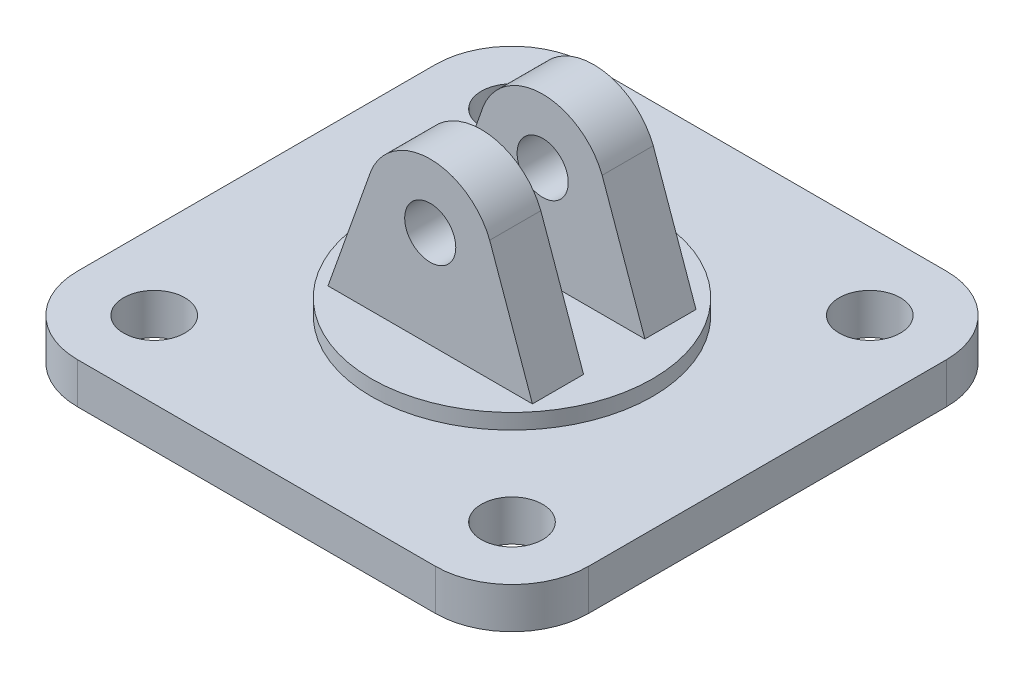
ISO-10303-21;
HEADER;
FILE_DESCRIPTION(('STEP AP214'),'2;1');
FILE_NAME('part.step','',(''),(''),'','','');
FILE_SCHEMA(('AUTOMOTIVE_DESIGN { 1 0 10303 214 1 1 1 1 }'));
ENDSEC;
DATA;
#1=APPLICATION_CONTEXT('core data for automotive mechanical design processes');
#2=APPLICATION_PROTOCOL_DEFINITION('international standard','automotive_design',2000,#1);
#3=PRODUCT_CONTEXT('',#1,'mechanical');
#4=PRODUCT('Part','Part','',(#3));
#5=PRODUCT_RELATED_PRODUCT_CATEGORY('part','',(#4));
#6=PRODUCT_DEFINITION_FORMATION('','',#4);
#7=PRODUCT_DEFINITION_CONTEXT('part definition',#1,'design');
#8=PRODUCT_DEFINITION('design','',#6,#7);
#9=PRODUCT_DEFINITION_SHAPE('','',#8);
#10=(LENGTH_UNIT() NAMED_UNIT(*) SI_UNIT(.MILLI.,.METRE.));
#11=(NAMED_UNIT(*) PLANE_ANGLE_UNIT() SI_UNIT($,.RADIAN.));
#12=(NAMED_UNIT(*) SI_UNIT($,.STERADIAN.) SOLID_ANGLE_UNIT());
#13=UNCERTAINTY_MEASURE_WITH_UNIT(LENGTH_MEASURE(1.E-05),#10,'distance_accuracy_value','');
#14=(GEOMETRIC_REPRESENTATION_CONTEXT(3) GLOBAL_UNCERTAINTY_ASSIGNED_CONTEXT((#13)) GLOBAL_UNIT_ASSIGNED_CONTEXT((#10,
#11,#12)) REPRESENTATION_CONTEXT('',''));
#15=CARTESIAN_POINT('',(0.,0.,0.));
#16=DIRECTION('',(0.,0.,1.));
#17=DIRECTION('',(1.,0.,0.));
#18=AXIS2_PLACEMENT_3D('',#15,#16,#17);
#19=CARTESIAN_POINT('',(21.2299093237961,7.53448680981674,16.));
#20=DIRECTION('',(0.942409652489535,0.334460830134942,0.));
#21=DIRECTION('',(-0.334460830134942,0.942409652489535,0.));
#22=AXIS2_PLACEMENT_3D('',#19,#20,#21);
#23=PLANE('',#22);
#24=DIRECTION('',(0.,0.,-1.));
#25=VECTOR('',#24,1.);
#26=CARTESIAN_POINT('',(20.,11.,16.));
#27=LINE('',#26,#25);
#28=CARTESIAN_POINT('',(20.,11.,16.));
#29=VERTEX_POINT('',#28);
#30=CARTESIAN_POINT('',(20.,11.,6.));
#31=VERTEX_POINT('',#30);
#32=EDGE_CURVE('E219',#29,#31,#27,.T.);
#33=ORIENTED_EDGE('',*,*,#32,.T.);
#34=DIRECTION('',(-0.334460830134942,0.942409652489535,0.));
#35=VECTOR('',#34,1.);
#36=CARTESIAN_POINT('',(21.2299093237961,7.53448680981674,6.));
#37=LINE('',#36,#35);
#38=CARTESIAN_POINT('',(11.6384792466265,34.5602413122384,6.));
#39=VERTEX_POINT('',#38);
#40=EDGE_CURVE('E388',#31,#39,#37,.T.);
#41=ORIENTED_EDGE('',*,*,#40,.T.);
#42=DIRECTION('',(0.,0.,-1.));
#43=VECTOR('',#42,1.);
#44=CARTESIAN_POINT('',(11.6384792466264,34.5602413122384,16.));
#45=LINE('',#44,#43);
#46=CARTESIAN_POINT('',(11.6384792466264,34.5602413122384,16.));
#47=VERTEX_POINT('',#46);
#48=EDGE_CURVE('E231',#47,#39,#45,.T.);
#49=ORIENTED_EDGE('',*,*,#48,.F.);
#50=DIRECTION('',(0.334460830134942,-0.942409652489535,0.));
#51=VECTOR('',#50,1.);
#52=CARTESIAN_POINT('',(21.2299093237961,7.53448680981674,16.));
#53=LINE('',#52,#51);
#54=EDGE_CURVE('E401',#47,#29,#53,.T.);
#55=ORIENTED_EDGE('',*,*,#54,.T.);
#56=EDGE_LOOP('',(#33,#41,#49,#55));
#57=FACE_BOUND('',#56,.T.);
#58=ADVANCED_FACE('F35',(#57),#23,.T.);
#59=CARTESIAN_POINT('',(0.,30.,16.));
#60=DIRECTION('',(0.,0.,-1.));
#61=DIRECTION('',(-1.,0.,0.));
#62=AXIS2_PLACEMENT_3D('',#59,#60,#61);
#63=CYLINDRICAL_SURFACE('',#62,12.5);
#64=CARTESIAN_POINT('',(0.,30.,6.));
#65=DIRECTION('',(0.,0.,-1.));
#66=DIRECTION('',(-1.,0.,0.));
#67=AXIS2_PLACEMENT_3D('',#64,#65,#66);
#68=CIRCLE('',#67,12.5);
#69=CARTESIAN_POINT('',(-11.6384792466266,34.5602413122381,6.));
#70=VERTEX_POINT('',#69);
#71=EDGE_CURVE('E385',#70,#39,#68,.T.);
#72=ORIENTED_EDGE('',*,*,#71,.F.);
#73=DIRECTION('',(0.,0.,-1.));
#74=VECTOR('',#73,1.);
#75=CARTESIAN_POINT('',(-11.6384792466266,34.5602413122381,16.));
#76=LINE('',#75,#74);
#77=CARTESIAN_POINT('',(-11.6384792466266,34.5602413122381,16.));
#78=VERTEX_POINT('',#77);
#79=EDGE_CURVE('E227',#78,#70,#76,.T.);
#80=ORIENTED_EDGE('',*,*,#79,.F.);
#81=CARTESIAN_POINT('',(0.,30.,16.));
#82=DIRECTION('',(0.,0.,1.));
#83=DIRECTION('',(1.,0.,0.));
#84=AXIS2_PLACEMENT_3D('',#81,#82,#83);
#85=CIRCLE('',#84,12.5);
#86=EDGE_CURVE('E405',#47,#78,#85,.T.);
#87=ORIENTED_EDGE('',*,*,#86,.F.);
#88=ORIENTED_EDGE('',*,*,#48,.T.);
#89=EDGE_LOOP('',(#72,#80,#87,#88));
#90=FACE_BOUND('',#89,.T.);
#91=ADVANCED_FACE('F431',(#90),#63,.T.);
#92=CARTESIAN_POINT('',(-21.2299093237961,7.53448680981671,16.));
#93=DIRECTION('',(-0.942409652489535,0.334460830134941,0.));
#94=DIRECTION('',(-0.334460830134941,-0.942409652489535,0.));
#95=AXIS2_PLACEMENT_3D('',#92,#93,#94);
#96=PLANE('',#95);
#97=ORIENTED_EDGE('',*,*,#79,.T.);
#98=DIRECTION('',(-0.334460830134941,-0.942409652489535,0.));
#99=VECTOR('',#98,1.);
#100=CARTESIAN_POINT('',(-21.2299093237961,7.53448680981671,6.));
#101=LINE('',#100,#99);
#102=CARTESIAN_POINT('',(-20.,11.,6.));
#103=VERTEX_POINT('',#102);
#104=EDGE_CURVE('E382',#70,#103,#101,.T.);
#105=ORIENTED_EDGE('',*,*,#104,.T.);
#106=DIRECTION('',(0.,0.,-1.));
#107=VECTOR('',#106,1.);
#108=CARTESIAN_POINT('',(-20.,11.,16.));
#109=LINE('',#108,#107);
#110=CARTESIAN_POINT('',(-20.,11.,16.));
#111=VERTEX_POINT('',#110);
#112=EDGE_CURVE('E218',#111,#103,#109,.T.);
#113=ORIENTED_EDGE('',*,*,#112,.F.);
#114=DIRECTION('',(0.334460830134941,0.942409652489535,0.));
#115=VECTOR('',#114,1.);
#116=CARTESIAN_POINT('',(-21.2299093237961,7.53448680981671,16.));
#117=LINE('',#116,#115);
#118=EDGE_CURVE('E407',#111,#78,#117,.T.);
#119=ORIENTED_EDGE('',*,*,#118,.T.);
#120=EDGE_LOOP('',(#97,#105,#113,#119));
#121=FACE_BOUND('',#120,.T.);
#122=ADVANCED_FACE('F438',(#121),#96,.T.);
#123=CARTESIAN_POINT('',(0.,30.,16.));
#124=DIRECTION('',(0.,0.,-1.));
#125=DIRECTION('',(-1.,0.,0.));
#126=AXIS2_PLACEMENT_3D('',#123,#124,#125);
#127=CYLINDRICAL_SURFACE('',#126,5.);
#128=CARTESIAN_POINT('',(0.,30.,16.));
#129=DIRECTION('',(0.,0.,1.));
#130=DIRECTION('',(1.,0.,0.));
#131=AXIS2_PLACEMENT_3D('',#128,#129,#130);
#132=CIRCLE('',#131,5.);
#133=CARTESIAN_POINT('',(5.,30.,16.));
#134=VERTEX_POINT('',#133);
#135=EDGE_CURVE('E398',#134,#134,#132,.T.);
#136=ORIENTED_EDGE('',*,*,#135,.T.);
#137=EDGE_LOOP('',(#136));
#138=FACE_BOUND('',#137,.T.);
#139=CARTESIAN_POINT('',(0.,30.,6.));
#140=DIRECTION('',(0.,0.,-1.));
#141=DIRECTION('',(-1.,0.,0.));
#142=AXIS2_PLACEMENT_3D('',#139,#140,#141);
#143=CIRCLE('',#142,5.);
#144=CARTESIAN_POINT('',(-5.,30.,6.));
#145=VERTEX_POINT('',#144);
#146=EDGE_CURVE('E212',#145,#145,#143,.T.);
#147=ORIENTED_EDGE('',*,*,#146,.T.);
#148=EDGE_LOOP('',(#147));
#149=FACE_BOUND('',#148,.T.);
#150=ADVANCED_FACE('F452',(#138,#149),#127,.F.);
#151=CARTESIAN_POINT('',(0.,11.,0.));
#152=DIRECTION('',(0.,1.,0.));
#153=DIRECTION('',(0.,0.,1.));
#154=AXIS2_PLACEMENT_3D('',#151,#152,#153);
#155=PLANE('',#154);
#156=DIRECTION('',(1.,0.,0.));
#157=VECTOR('',#156,1.);
#158=CARTESIAN_POINT('',(-20.,11.,6.));
#159=LINE('',#158,#157);
#160=EDGE_CURVE('E52',#103,#31,#159,.T.);
#161=ORIENTED_EDGE('',*,*,#160,.T.);
#162=ORIENTED_EDGE('',*,*,#32,.F.);
#163=DIRECTION('',(1.,0.,0.));
#164=VECTOR('',#163,1.);
#165=CARTESIAN_POINT('',(0.,11.,16.));
#166=LINE('',#165,#164);
#167=EDGE_CURVE('E410',#111,#29,#166,.T.);
#168=ORIENTED_EDGE('',*,*,#167,.F.);
#169=ORIENTED_EDGE('',*,*,#112,.T.);
#170=EDGE_LOOP('',(#161,#162,#168,#169));
#171=FACE_BOUND('',#170,.T.);
#172=CARTESIAN_POINT('',(0.,11.,0.));
#173=DIRECTION('',(0.,1.,0.));
#174=DIRECTION('',(0.,0.,1.));
#175=AXIS2_PLACEMENT_3D('',#172,#173,#174);
#176=CIRCLE('',#175,27.5);
#177=CARTESIAN_POINT('',(0.,11.,27.5));
#178=VERTEX_POINT('',#177);
#179=EDGE_CURVE('E320',#178,#178,#176,.T.);
#180=ORIENTED_EDGE('',*,*,#179,.T.);
#181=EDGE_LOOP('',(#180));
#182=FACE_BOUND('',#181,.T.);
#183=CARTESIAN_POINT('',(20.,11.,-6.));
#184=VERTEX_POINT('',#183);
#185=CARTESIAN_POINT('',(20.,11.,-16.));
#186=VERTEX_POINT('',#185);
#187=EDGE_CURVE('E211',#184,#186,#27,.T.);
#188=ORIENTED_EDGE('',*,*,#187,.F.);
#189=DIRECTION('',(1.,0.,0.));
#190=VECTOR('',#189,1.);
#191=CARTESIAN_POINT('',(-20.,11.,-6.));
#192=LINE('',#191,#190);
#193=CARTESIAN_POINT('',(-20.,11.,-6.));
#194=VERTEX_POINT('',#193);
#195=EDGE_CURVE('E202',#194,#184,#192,.T.);
#196=ORIENTED_EDGE('',*,*,#195,.F.);
#197=CARTESIAN_POINT('',(-20.,11.,-16.));
#198=VERTEX_POINT('',#197);
#199=EDGE_CURVE('E60',#194,#198,#109,.T.);
#200=ORIENTED_EDGE('',*,*,#199,.T.);
#201=DIRECTION('',(1.,0.,0.));
#202=VECTOR('',#201,1.);
#203=CARTESIAN_POINT('',(0.,11.,-16.));
#204=LINE('',#203,#202);
#205=EDGE_CURVE('E402',#198,#186,#204,.T.);
#206=ORIENTED_EDGE('',*,*,#205,.T.);
#207=EDGE_LOOP('',(#188,#196,#200,#206));
#208=FACE_BOUND('',#207,.T.);
#209=ADVANCED_FACE('F210',(#171,#182,#208),#155,.T.);
#210=CARTESIAN_POINT('',(35.,8.,35.));
#211=DIRECTION('',(0.,-1.,0.));
#212=DIRECTION('',(0.,0.,-1.));
#213=AXIS2_PLACEMENT_3D('',#210,#211,#212);
#214=CYLINDRICAL_SURFACE('',#213,15.);
#215=CARTESIAN_POINT('',(35.,0.,35.));
#216=DIRECTION('',(0.,1.,0.));
#217=DIRECTION('',(0.,0.,-1.));
#218=AXIS2_PLACEMENT_3D('',#215,#216,#217);
#219=CIRCLE('',#218,15.);
#220=CARTESIAN_POINT('',(34.9999999999999,0.,50.));
#221=VERTEX_POINT('',#220);
#222=CARTESIAN_POINT('',(50.,0.,34.9999999999999));
#223=VERTEX_POINT('',#222);
#224=EDGE_CURVE('E324',#221,#223,#219,.T.);
#225=ORIENTED_EDGE('',*,*,#224,.T.);
#226=DIRECTION('',(0.,-1.,0.));
#227=VECTOR('',#226,1.);
#228=CARTESIAN_POINT('',(50.,8.,34.9999999999999));
#229=LINE('',#228,#227);
#230=CARTESIAN_POINT('',(50.,8.,34.9999999999999));
#231=VERTEX_POINT('',#230);
#232=EDGE_CURVE('E44',#231,#223,#229,.T.);
#233=ORIENTED_EDGE('',*,*,#232,.F.);
#234=CARTESIAN_POINT('',(35.,8.,35.));
#235=DIRECTION('',(0.,1.,0.));
#236=DIRECTION('',(0.,0.,-1.));
#237=AXIS2_PLACEMENT_3D('',#234,#235,#236);
#238=CIRCLE('',#237,15.);
#239=CARTESIAN_POINT('',(34.9999999999999,8.,50.));
#240=VERTEX_POINT('',#239);
#241=EDGE_CURVE('E326',#240,#231,#238,.T.);
#242=ORIENTED_EDGE('',*,*,#241,.F.);
#243=DIRECTION('',(0.,-1.,0.));
#244=VECTOR('',#243,1.);
#245=CARTESIAN_POINT('',(34.9999999999999,8.,50.));
#246=LINE('',#245,#244);
#247=EDGE_CURVE('E344',#240,#221,#246,.T.);
#248=ORIENTED_EDGE('',*,*,#247,.T.);
#249=EDGE_LOOP('',(#225,#233,#242,#248));
#250=FACE_BOUND('',#249,.T.);
#251=ADVANCED_FACE('F37',(#250),#214,.T.);
#252=CARTESIAN_POINT('',(50.,8.,-34.9999999999999));
#253=DIRECTION('',(-1.,0.,0.));
#254=DIRECTION('',(0.,0.,1.));
#255=AXIS2_PLACEMENT_3D('',#252,#253,#254);
#256=PLANE('',#255);
#257=DIRECTION('',(0.,0.,-1.));
#258=VECTOR('',#257,1.);
#259=CARTESIAN_POINT('',(50.,0.,-34.9999999999999));
#260=LINE('',#259,#258);
#261=CARTESIAN_POINT('',(50.,0.,-34.9999999999999));
#262=VERTEX_POINT('',#261);
#263=EDGE_CURVE('E347',#223,#262,#260,.T.);
#264=ORIENTED_EDGE('',*,*,#263,.T.);
#265=DIRECTION('',(0.,-1.,0.));
#266=VECTOR('',#265,1.);
#267=CARTESIAN_POINT('',(50.,8.,-34.9999999999999));
#268=LINE('',#267,#266);
#269=CARTESIAN_POINT('',(50.,8.,-34.9999999999999));
#270=VERTEX_POINT('',#269);
#271=EDGE_CURVE('E377',#270,#262,#268,.T.);
#272=ORIENTED_EDGE('',*,*,#271,.F.);
#273=DIRECTION('',(0.,0.,-1.));
#274=VECTOR('',#273,1.);
#275=CARTESIAN_POINT('',(50.,8.,-34.9999999999999));
#276=LINE('',#275,#274);
#277=EDGE_CURVE('E329',#231,#270,#276,.T.);
#278=ORIENTED_EDGE('',*,*,#277,.F.);
#279=ORIENTED_EDGE('',*,*,#232,.T.);
#280=EDGE_LOOP('',(#264,#272,#278,#279));
#281=FACE_BOUND('',#280,.T.);
#282=ADVANCED_FACE('F541',(#281),#256,.F.);
#283=CARTESIAN_POINT('',(35.,8.,-35.));
#284=DIRECTION('',(0.,-1.,0.));
#285=DIRECTION('',(0.,0.,-1.));
#286=AXIS2_PLACEMENT_3D('',#283,#284,#285);
#287=CYLINDRICAL_SURFACE('',#286,15.);
#288=CARTESIAN_POINT('',(35.,0.,-35.));
#289=DIRECTION('',(0.,1.,0.));
#290=DIRECTION('',(0.,0.,-1.));
#291=AXIS2_PLACEMENT_3D('',#288,#289,#290);
#292=CIRCLE('',#291,15.);
#293=CARTESIAN_POINT('',(34.9999999999999,0.,-50.));
#294=VERTEX_POINT('',#293);
#295=EDGE_CURVE('E349',#262,#294,#292,.T.);
#296=ORIENTED_EDGE('',*,*,#295,.T.);
#297=DIRECTION('',(0.,-1.,0.));
#298=VECTOR('',#297,1.);
#299=CARTESIAN_POINT('',(34.9999999999999,8.,-50.));
#300=LINE('',#299,#298);
#301=CARTESIAN_POINT('',(34.9999999999999,8.,-50.));
#302=VERTEX_POINT('',#301);
#303=EDGE_CURVE('E374',#302,#294,#300,.T.);
#304=ORIENTED_EDGE('',*,*,#303,.F.);
#305=CARTESIAN_POINT('',(35.,8.,-35.));
#306=DIRECTION('',(0.,1.,0.));
#307=DIRECTION('',(0.,0.,-1.));
#308=AXIS2_PLACEMENT_3D('',#305,#306,#307);
#309=CIRCLE('',#308,15.);
#310=EDGE_CURVE('E332',#270,#302,#309,.T.);
#311=ORIENTED_EDGE('',*,*,#310,.F.);
#312=ORIENTED_EDGE('',*,*,#271,.T.);
#313=EDGE_LOOP('',(#296,#304,#311,#312));
#314=FACE_BOUND('',#313,.T.);
#315=ADVANCED_FACE('F538',(#314),#287,.T.);
#316=CARTESIAN_POINT('',(34.9999999999999,8.,-50.));
#317=DIRECTION('',(0.,0.,1.));
#318=DIRECTION('',(1.,0.,0.));
#319=AXIS2_PLACEMENT_3D('',#316,#317,#318);
#320=PLANE('',#319);
#321=DIRECTION('',(-1.,0.,0.));
#322=VECTOR('',#321,1.);
#323=CARTESIAN_POINT('',(34.9999999999999,0.,-50.));
#324=LINE('',#323,#322);
#325=CARTESIAN_POINT('',(-34.9999999999999,0.,-50.));
#326=VERTEX_POINT('',#325);
#327=EDGE_CURVE('E351',#294,#326,#324,.T.);
#328=ORIENTED_EDGE('',*,*,#327,.T.);
#329=DIRECTION('',(0.,-1.,0.));
#330=VECTOR('',#329,1.);
#331=CARTESIAN_POINT('',(-34.9999999999999,8.,-50.));
#332=LINE('',#331,#330);
#333=CARTESIAN_POINT('',(-34.9999999999999,8.,-50.));
#334=VERTEX_POINT('',#333);
#335=EDGE_CURVE('E371',#334,#326,#332,.T.);
#336=ORIENTED_EDGE('',*,*,#335,.F.);
#337=DIRECTION('',(-1.,0.,0.));
#338=VECTOR('',#337,1.);
#339=CARTESIAN_POINT('',(34.9999999999999,8.,-50.));
#340=LINE('',#339,#338);
#341=EDGE_CURVE('E334',#302,#334,#340,.T.);
#342=ORIENTED_EDGE('',*,*,#341,.F.);
#343=ORIENTED_EDGE('',*,*,#303,.T.);
#344=EDGE_LOOP('',(#328,#336,#342,#343));
#345=FACE_BOUND('',#344,.T.);
#346=ADVANCED_FACE('F534',(#345),#320,.F.);
#347=CARTESIAN_POINT('',(-35.,8.,-35.));
#348=DIRECTION('',(0.,-1.,0.));
#349=DIRECTION('',(0.,0.,-1.));
#350=AXIS2_PLACEMENT_3D('',#347,#348,#349);
#351=CYLINDRICAL_SURFACE('',#350,15.);
#352=CARTESIAN_POINT('',(-35.,0.,-35.));
#353=DIRECTION('',(0.,1.,0.));
#354=DIRECTION('',(0.,0.,1.));
#355=AXIS2_PLACEMENT_3D('',#352,#353,#354);
#356=CIRCLE('',#355,15.);
#357=CARTESIAN_POINT('',(-50.,0.,-34.9999999999999));
#358=VERTEX_POINT('',#357);
#359=EDGE_CURVE('E353',#326,#358,#356,.T.);
#360=ORIENTED_EDGE('',*,*,#359,.T.);
#361=DIRECTION('',(0.,-1.,0.));
#362=VECTOR('',#361,1.);
#363=CARTESIAN_POINT('',(-50.,8.,-34.9999999999999));
#364=LINE('',#363,#362);
#365=CARTESIAN_POINT('',(-50.,8.,-34.9999999999999));
#366=VERTEX_POINT('',#365);
#367=EDGE_CURVE('E368',#366,#358,#364,.T.);
#368=ORIENTED_EDGE('',*,*,#367,.F.);
#369=CARTESIAN_POINT('',(-35.,8.,-35.));
#370=DIRECTION('',(0.,1.,0.));
#371=DIRECTION('',(0.,0.,1.));
#372=AXIS2_PLACEMENT_3D('',#369,#370,#371);
#373=CIRCLE('',#372,15.);
#374=EDGE_CURVE('E336',#334,#366,#373,.T.);
#375=ORIENTED_EDGE('',*,*,#374,.F.);
#376=ORIENTED_EDGE('',*,*,#335,.T.);
#377=EDGE_LOOP('',(#360,#368,#375,#376));
#378=FACE_BOUND('',#377,.T.);
#379=ADVANCED_FACE('F530',(#378),#351,.T.);
#380=CARTESIAN_POINT('',(-50.,8.,-34.9999999999999));
#381=DIRECTION('',(1.,0.,0.));
#382=DIRECTION('',(0.,0.,-1.));
#383=AXIS2_PLACEMENT_3D('',#380,#381,#382);
#384=PLANE('',#383);
#385=DIRECTION('',(0.,0.,1.));
#386=VECTOR('',#385,1.);
#387=CARTESIAN_POINT('',(-50.,0.,-34.9999999999999));
#388=LINE('',#387,#386);
#389=CARTESIAN_POINT('',(-50.,0.,34.9999999999999));
#390=VERTEX_POINT('',#389);
#391=EDGE_CURVE('E355',#358,#390,#388,.T.);
#392=ORIENTED_EDGE('',*,*,#391,.T.);
#393=DIRECTION('',(0.,-1.,0.));
#394=VECTOR('',#393,1.);
#395=CARTESIAN_POINT('',(-50.,8.,34.9999999999999));
#396=LINE('',#395,#394);
#397=CARTESIAN_POINT('',(-50.,8.,34.9999999999999));
#398=VERTEX_POINT('',#397);
#399=EDGE_CURVE('E365',#398,#390,#396,.T.);
#400=ORIENTED_EDGE('',*,*,#399,.F.);
#401=DIRECTION('',(0.,0.,1.));
#402=VECTOR('',#401,1.);
#403=CARTESIAN_POINT('',(-50.,8.,-34.9999999999999));
#404=LINE('',#403,#402);
#405=EDGE_CURVE('E338',#366,#398,#404,.T.);
#406=ORIENTED_EDGE('',*,*,#405,.F.);
#407=ORIENTED_EDGE('',*,*,#367,.T.);
#408=EDGE_LOOP('',(#392,#400,#406,#407));
#409=FACE_BOUND('',#408,.T.);
#410=ADVANCED_FACE('F526',(#409),#384,.F.);
#411=CARTESIAN_POINT('',(-35.,8.,35.));
#412=DIRECTION('',(0.,-1.,0.));
#413=DIRECTION('',(0.,0.,-1.));
#414=AXIS2_PLACEMENT_3D('',#411,#412,#413);
#415=CYLINDRICAL_SURFACE('',#414,15.);
#416=CARTESIAN_POINT('',(-35.,0.,35.));
#417=DIRECTION('',(0.,1.,0.));
#418=DIRECTION('',(0.,0.,-1.));
#419=AXIS2_PLACEMENT_3D('',#416,#417,#418);
#420=CIRCLE('',#419,15.);
#421=CARTESIAN_POINT('',(-34.9999999999999,0.,50.));
#422=VERTEX_POINT('',#421);
#423=EDGE_CURVE('E357',#390,#422,#420,.T.);
#424=ORIENTED_EDGE('',*,*,#423,.T.);
#425=DIRECTION('',(0.,-1.,0.));
#426=VECTOR('',#425,1.);
#427=CARTESIAN_POINT('',(-34.9999999999999,8.,50.));
#428=LINE('',#427,#426);
#429=CARTESIAN_POINT('',(-34.9999999999999,8.,50.));
#430=VERTEX_POINT('',#429);
#431=EDGE_CURVE('E362',#430,#422,#428,.T.);
#432=ORIENTED_EDGE('',*,*,#431,.F.);
#433=CARTESIAN_POINT('',(-35.,8.,35.));
#434=DIRECTION('',(0.,1.,0.));
#435=DIRECTION('',(0.,0.,-1.));
#436=AXIS2_PLACEMENT_3D('',#433,#434,#435);
#437=CIRCLE('',#436,15.);
#438=EDGE_CURVE('E340',#398,#430,#437,.T.);
#439=ORIENTED_EDGE('',*,*,#438,.F.);
#440=ORIENTED_EDGE('',*,*,#399,.T.);
#441=EDGE_LOOP('',(#424,#432,#439,#440));
#442=FACE_BOUND('',#441,.T.);
#443=ADVANCED_FACE('F522',(#442),#415,.T.);
#444=CARTESIAN_POINT('',(34.9999999999999,8.,50.));
#445=DIRECTION('',(0.,0.,-1.));
#446=DIRECTION('',(-1.,0.,0.));
#447=AXIS2_PLACEMENT_3D('',#444,#445,#446);
#448=PLANE('',#447);
#449=DIRECTION('',(1.,0.,0.));
#450=VECTOR('',#449,1.);
#451=CARTESIAN_POINT('',(34.9999999999999,0.,50.));
#452=LINE('',#451,#450);
#453=EDGE_CURVE('E330',#422,#221,#452,.T.);
#454=ORIENTED_EDGE('',*,*,#453,.T.);
#455=ORIENTED_EDGE('',*,*,#247,.F.);
#456=DIRECTION('',(1.,0.,0.));
#457=VECTOR('',#456,1.);
#458=CARTESIAN_POINT('',(34.9999999999999,8.,50.));
#459=LINE('',#458,#457);
#460=EDGE_CURVE('E342',#430,#240,#459,.T.);
#461=ORIENTED_EDGE('',*,*,#460,.F.);
#462=ORIENTED_EDGE('',*,*,#431,.T.);
#463=EDGE_LOOP('',(#454,#455,#461,#462));
#464=FACE_BOUND('',#463,.T.);
#465=ADVANCED_FACE('F515',(#464),#448,.F.);
#466=CARTESIAN_POINT('',(35.,8.,35.));
#467=DIRECTION('',(0.,-1.,0.));
#468=DIRECTION('',(0.,0.,-1.));
#469=AXIS2_PLACEMENT_3D('',#466,#467,#468);
#470=PLANE('',#469);
#471=CARTESIAN_POINT('',(-35.,8.,35.));
#472=DIRECTION('',(0.,1.,0.));
#473=DIRECTION('',(0.,0.,1.));
#474=AXIS2_PLACEMENT_3D('',#471,#472,#473);
#475=CIRCLE('',#474,6.);
#476=CARTESIAN_POINT('',(-35.,8.,41.));
#477=VERTEX_POINT('',#476);
#478=EDGE_CURVE('E303',#477,#477,#475,.T.);
#479=ORIENTED_EDGE('',*,*,#478,.F.);
#480=EDGE_LOOP('',(#479));
#481=FACE_BOUND('',#480,.T.);
#482=CARTESIAN_POINT('',(35.,8.,-35.));
#483=DIRECTION('',(0.,1.,0.));
#484=DIRECTION('',(0.,0.,1.));
#485=AXIS2_PLACEMENT_3D('',#482,#483,#484);
#486=CIRCLE('',#485,6.);
#487=CARTESIAN_POINT('',(35.,8.,-29.));
#488=VERTEX_POINT('',#487);
#489=EDGE_CURVE('E309',#488,#488,#486,.T.);
#490=ORIENTED_EDGE('',*,*,#489,.F.);
#491=EDGE_LOOP('',(#490));
#492=FACE_BOUND('',#491,.T.);
#493=CARTESIAN_POINT('',(35.,8.,35.));
#494=DIRECTION('',(0.,1.,0.));
#495=DIRECTION('',(0.,0.,1.));
#496=AXIS2_PLACEMENT_3D('',#493,#494,#495);
#497=CIRCLE('',#496,6.);
#498=CARTESIAN_POINT('',(35.,8.,41.));
#499=VERTEX_POINT('',#498);
#500=EDGE_CURVE('E284',#499,#499,#497,.T.);
#501=ORIENTED_EDGE('',*,*,#500,.F.);
#502=EDGE_LOOP('',(#501));
#503=FACE_BOUND('',#502,.T.);
#504=CARTESIAN_POINT('',(-35.,8.,-35.));
#505=DIRECTION('',(0.,1.,0.));
#506=DIRECTION('',(0.,0.,1.));
#507=AXIS2_PLACEMENT_3D('',#504,#505,#506);
#508=CIRCLE('',#507,6.);
#509=CARTESIAN_POINT('',(-35.,8.,-29.));
#510=VERTEX_POINT('',#509);
#511=EDGE_CURVE('E302',#510,#510,#508,.T.);
#512=ORIENTED_EDGE('',*,*,#511,.F.);
#513=EDGE_LOOP('',(#512));
#514=FACE_BOUND('',#513,.T.);
#515=CARTESIAN_POINT('',(0.,8.,0.));
#516=DIRECTION('',(0.,1.,0.));
#517=DIRECTION('',(0.,0.,1.));
#518=AXIS2_PLACEMENT_3D('',#515,#516,#517);
#519=CIRCLE('',#518,27.5);
#520=CARTESIAN_POINT('',(0.,8.,27.5));
#521=VERTEX_POINT('',#520);
#522=EDGE_CURVE('E11',#521,#521,#519,.T.);
#523=ORIENTED_EDGE('',*,*,#522,.F.);
#524=EDGE_LOOP('',(#523));
#525=FACE_BOUND('',#524,.T.);
#526=ORIENTED_EDGE('',*,*,#241,.T.);
#527=ORIENTED_EDGE('',*,*,#277,.T.);
#528=ORIENTED_EDGE('',*,*,#310,.T.);
#529=ORIENTED_EDGE('',*,*,#341,.T.);
#530=ORIENTED_EDGE('',*,*,#374,.T.);
#531=ORIENTED_EDGE('',*,*,#405,.T.);
#532=ORIENTED_EDGE('',*,*,#438,.T.);
#533=ORIENTED_EDGE('',*,*,#460,.T.);
#534=EDGE_LOOP('',(#526,#527,#528,#529,#530,#531,#532,#533));
#535=FACE_BOUND('',#534,.T.);
#536=ADVANCED_FACE('F512',(#481,#492,#503,#514,#525,#535),#470,.F.);
#537=CARTESIAN_POINT('',(35.,0.,35.));
#538=DIRECTION('',(0.,-1.,0.));
#539=DIRECTION('',(0.,0.,-1.));
#540=AXIS2_PLACEMENT_3D('',#537,#538,#539);
#541=PLANE('',#540);
#542=CARTESIAN_POINT('',(-20.,0.,20.));
#543=DIRECTION('',(0.,-1.,0.));
#544=DIRECTION('',(0.,0.,1.));
#545=AXIS2_PLACEMENT_3D('',#542,#543,#544);
#546=CIRCLE('',#545,5.);
#547=CARTESIAN_POINT('',(-20.,0.,25.));
#548=VERTEX_POINT('',#547);
#549=CARTESIAN_POINT('',(-25.,0.,20.));
#550=VERTEX_POINT('',#549);
#551=EDGE_CURVE('E234',#548,#550,#546,.T.);
#552=ORIENTED_EDGE('',*,*,#551,.F.);
#553=DIRECTION('',(-1.,0.,0.));
#554=VECTOR('',#553,1.);
#555=CARTESIAN_POINT('',(-20.,0.,25.));
#556=LINE('',#555,#554);
#557=CARTESIAN_POINT('',(20.,0.,25.));
#558=VERTEX_POINT('',#557);
#559=EDGE_CURVE('E239',#558,#548,#556,.T.);
#560=ORIENTED_EDGE('',*,*,#559,.F.);
#561=CARTESIAN_POINT('',(20.,0.,20.));
#562=DIRECTION('',(0.,-1.,0.));
#563=DIRECTION('',(0.,0.,1.));
#564=AXIS2_PLACEMENT_3D('',#561,#562,#563);
#565=CIRCLE('',#564,5.);
#566=CARTESIAN_POINT('',(25.,0.,20.));
#567=VERTEX_POINT('',#566);
#568=EDGE_CURVE('E277',#567,#558,#565,.T.);
#569=ORIENTED_EDGE('',*,*,#568,.F.);
#570=DIRECTION('',(0.,0.,1.));
#571=VECTOR('',#570,1.);
#572=CARTESIAN_POINT('',(25.,0.,-20.));
#573=LINE('',#572,#571);
#574=CARTESIAN_POINT('',(25.,0.,-20.));
#575=VERTEX_POINT('',#574);
#576=EDGE_CURVE('E274',#575,#567,#573,.T.);
#577=ORIENTED_EDGE('',*,*,#576,.F.);
#578=CARTESIAN_POINT('',(20.,0.,-20.));
#579=DIRECTION('',(0.,-1.,0.));
#580=DIRECTION('',(0.,0.,-1.));
#581=AXIS2_PLACEMENT_3D('',#578,#579,#580);
#582=CIRCLE('',#581,5.);
#583=CARTESIAN_POINT('',(20.,0.,-25.));
#584=VERTEX_POINT('',#583);
#585=EDGE_CURVE('E271',#584,#575,#582,.T.);
#586=ORIENTED_EDGE('',*,*,#585,.F.);
#587=DIRECTION('',(1.,0.,0.));
#588=VECTOR('',#587,1.);
#589=CARTESIAN_POINT('',(-20.,0.,-25.));
#590=LINE('',#589,#588);
#591=CARTESIAN_POINT('',(-20.,0.,-25.));
#592=VERTEX_POINT('',#591);
#593=EDGE_CURVE('E268',#592,#584,#590,.T.);
#594=ORIENTED_EDGE('',*,*,#593,.F.);
#595=CARTESIAN_POINT('',(-20.,0.,-20.));
#596=DIRECTION('',(0.,-1.,0.));
#597=DIRECTION('',(0.,0.,1.));
#598=AXIS2_PLACEMENT_3D('',#595,#596,#597);
#599=CIRCLE('',#598,5.);
#600=CARTESIAN_POINT('',(-25.,0.,-20.));
#601=VERTEX_POINT('',#600);
#602=EDGE_CURVE('E265',#601,#592,#599,.T.);
#603=ORIENTED_EDGE('',*,*,#602,.F.);
#604=DIRECTION('',(0.,0.,-1.));
#605=VECTOR('',#604,1.);
#606=CARTESIAN_POINT('',(-25.,0.,-20.));
#607=LINE('',#606,#605);
#608=EDGE_CURVE('E262',#550,#601,#607,.T.);
#609=ORIENTED_EDGE('',*,*,#608,.F.);
#610=EDGE_LOOP('',(#552,#560,#569,#577,#586,#594,#603,#609));
#611=FACE_BOUND('',#610,.T.);
#612=CARTESIAN_POINT('',(-35.,0.,35.));
#613=DIRECTION('',(0.,1.,0.));
#614=DIRECTION('',(0.,0.,1.));
#615=AXIS2_PLACEMENT_3D('',#612,#613,#614);
#616=CIRCLE('',#615,6.);
#617=CARTESIAN_POINT('',(-35.,0.,41.));
#618=VERTEX_POINT('',#617);
#619=EDGE_CURVE('E299',#618,#618,#616,.T.);
#620=ORIENTED_EDGE('',*,*,#619,.T.);
#621=EDGE_LOOP('',(#620));
#622=FACE_BOUND('',#621,.T.);
#623=CARTESIAN_POINT('',(35.,0.,-35.));
#624=DIRECTION('',(0.,1.,0.));
#625=DIRECTION('',(0.,0.,1.));
#626=AXIS2_PLACEMENT_3D('',#623,#624,#625);
#627=CIRCLE('',#626,6.);
#628=CARTESIAN_POINT('',(35.,0.,-29.));
#629=VERTEX_POINT('',#628);
#630=EDGE_CURVE('E306',#629,#629,#627,.T.);
#631=ORIENTED_EDGE('',*,*,#630,.T.);
#632=EDGE_LOOP('',(#631));
#633=FACE_BOUND('',#632,.T.);
#634=CARTESIAN_POINT('',(35.,0.,35.));
#635=DIRECTION('',(0.,1.,0.));
#636=DIRECTION('',(0.,0.,1.));
#637=AXIS2_PLACEMENT_3D('',#634,#635,#636);
#638=CIRCLE('',#637,6.);
#639=CARTESIAN_POINT('',(35.,0.,41.));
#640=VERTEX_POINT('',#639);
#641=EDGE_CURVE('E312',#640,#640,#638,.T.);
#642=ORIENTED_EDGE('',*,*,#641,.T.);
#643=EDGE_LOOP('',(#642));
#644=FACE_BOUND('',#643,.T.);
#645=CARTESIAN_POINT('',(-35.,0.,-35.));
#646=DIRECTION('',(0.,1.,0.));
#647=DIRECTION('',(0.,0.,1.));
#648=AXIS2_PLACEMENT_3D('',#645,#646,#647);
#649=CIRCLE('',#648,6.);
#650=CARTESIAN_POINT('',(-35.,0.,-29.));
#651=VERTEX_POINT('',#650);
#652=EDGE_CURVE('E317',#651,#651,#649,.T.);
#653=ORIENTED_EDGE('',*,*,#652,.T.);
#654=EDGE_LOOP('',(#653));
#655=FACE_BOUND('',#654,.T.);
#656=ORIENTED_EDGE('',*,*,#224,.F.);
#657=ORIENTED_EDGE('',*,*,#453,.F.);
#658=ORIENTED_EDGE('',*,*,#423,.F.);
#659=ORIENTED_EDGE('',*,*,#391,.F.);
#660=ORIENTED_EDGE('',*,*,#359,.F.);
#661=ORIENTED_EDGE('',*,*,#327,.F.);
#662=ORIENTED_EDGE('',*,*,#295,.F.);
#663=ORIENTED_EDGE('',*,*,#263,.F.);
#664=EDGE_LOOP('',(#656,#657,#658,#659,#660,#661,#662,#663));
#665=FACE_BOUND('',#664,.T.);
#666=ADVANCED_FACE('F510',(#611,#622,#633,#644,#655,#665),#541,.T.);
#667=CARTESIAN_POINT('',(0.,11.,0.));
#668=DIRECTION('',(0.,-1.,0.));
#669=DIRECTION('',(0.,0.,-1.));
#670=AXIS2_PLACEMENT_3D('',#667,#668,#669);
#671=CYLINDRICAL_SURFACE('',#670,27.5);
#672=ORIENTED_EDGE('',*,*,#179,.F.);
#673=EDGE_LOOP('',(#672));
#674=FACE_BOUND('',#673,.T.);
#675=ORIENTED_EDGE('',*,*,#522,.T.);
#676=EDGE_LOOP('',(#675));
#677=FACE_BOUND('',#676,.T.);
#678=ADVANCED_FACE('F503',(#674,#677),#671,.T.);
#679=CARTESIAN_POINT('',(-35.,0.,-35.));
#680=DIRECTION('',(0.,1.,0.));
#681=DIRECTION('',(0.,0.,1.));
#682=AXIS2_PLACEMENT_3D('',#679,#680,#681);
#683=CYLINDRICAL_SURFACE('',#682,6.);
#684=ORIENTED_EDGE('',*,*,#652,.F.);
#685=EDGE_LOOP('',(#684));
#686=FACE_BOUND('',#685,.T.);
#687=ORIENTED_EDGE('',*,*,#511,.T.);
#688=EDGE_LOOP('',(#687));
#689=FACE_BOUND('',#688,.T.);
#690=ADVANCED_FACE('F499',(#686,#689),#683,.F.);
#691=CARTESIAN_POINT('',(35.,0.,35.));
#692=DIRECTION('',(0.,1.,0.));
#693=DIRECTION('',(0.,0.,1.));
#694=AXIS2_PLACEMENT_3D('',#691,#692,#693);
#695=CYLINDRICAL_SURFACE('',#694,6.);
#696=ORIENTED_EDGE('',*,*,#641,.F.);
#697=EDGE_LOOP('',(#696));
#698=FACE_BOUND('',#697,.T.);
#699=ORIENTED_EDGE('',*,*,#500,.T.);
#700=EDGE_LOOP('',(#699));
#701=FACE_BOUND('',#700,.T.);
#702=ADVANCED_FACE('F495',(#698,#701),#695,.F.);
#703=CARTESIAN_POINT('',(35.,0.,-35.));
#704=DIRECTION('',(0.,1.,0.));
#705=DIRECTION('',(0.,0.,1.));
#706=AXIS2_PLACEMENT_3D('',#703,#704,#705);
#707=CYLINDRICAL_SURFACE('',#706,6.);
#708=ORIENTED_EDGE('',*,*,#630,.F.);
#709=EDGE_LOOP('',(#708));
#710=FACE_BOUND('',#709,.T.);
#711=ORIENTED_EDGE('',*,*,#489,.T.);
#712=EDGE_LOOP('',(#711));
#713=FACE_BOUND('',#712,.T.);
#714=ADVANCED_FACE('F491',(#710,#713),#707,.F.);
#715=CARTESIAN_POINT('',(-35.,0.,35.));
#716=DIRECTION('',(0.,1.,0.));
#717=DIRECTION('',(0.,0.,1.));
#718=AXIS2_PLACEMENT_3D('',#715,#716,#717);
#719=CYLINDRICAL_SURFACE('',#718,6.);
#720=ORIENTED_EDGE('',*,*,#619,.F.);
#721=EDGE_LOOP('',(#720));
#722=FACE_BOUND('',#721,.T.);
#723=ORIENTED_EDGE('',*,*,#478,.T.);
#724=EDGE_LOOP('',(#723));
#725=FACE_BOUND('',#724,.T.);
#726=ADVANCED_FACE('F487',(#722,#725),#719,.F.);
#727=CARTESIAN_POINT('',(-20.,2.,20.));
#728=DIRECTION('',(0.,-1.,0.));
#729=DIRECTION('',(0.,0.,-1.));
#730=AXIS2_PLACEMENT_3D('',#727,#728,#729);
#731=CYLINDRICAL_SURFACE('',#730,5.);
#732=ORIENTED_EDGE('',*,*,#551,.T.);
#733=DIRECTION('',(0.,-1.,0.));
#734=VECTOR('',#733,1.);
#735=CARTESIAN_POINT('',(-25.,2.,20.));
#736=LINE('',#735,#734);
#737=CARTESIAN_POINT('',(-25.,2.,20.));
#738=VERTEX_POINT('',#737);
#739=EDGE_CURVE('E260',#738,#550,#736,.T.);
#740=ORIENTED_EDGE('',*,*,#739,.F.);
#741=CARTESIAN_POINT('',(-20.,2.,20.));
#742=DIRECTION('',(0.,-1.,0.));
#743=DIRECTION('',(0.,0.,1.));
#744=AXIS2_PLACEMENT_3D('',#741,#742,#743);
#745=CIRCLE('',#744,5.);
#746=CARTESIAN_POINT('',(-20.,2.,25.));
#747=VERTEX_POINT('',#746);
#748=EDGE_CURVE('E235',#747,#738,#745,.T.);
#749=ORIENTED_EDGE('',*,*,#748,.F.);
#750=DIRECTION('',(0.,-1.,0.));
#751=VECTOR('',#750,1.);
#752=CARTESIAN_POINT('',(-20.,2.,25.));
#753=LINE('',#752,#751);
#754=EDGE_CURVE('E282',#747,#548,#753,.T.);
#755=ORIENTED_EDGE('',*,*,#754,.T.);
#756=EDGE_LOOP('',(#732,#740,#749,#755));
#757=FACE_BOUND('',#756,.T.);
#758=ADVANCED_FACE('F461',(#757),#731,.F.);
#759=CARTESIAN_POINT('',(-20.,2.,25.));
#760=DIRECTION('',(0.,0.,1.));
#761=DIRECTION('',(1.,0.,0.));
#762=AXIS2_PLACEMENT_3D('',#759,#760,#761);
#763=PLANE('',#762);
#764=ORIENTED_EDGE('',*,*,#559,.T.);
#765=ORIENTED_EDGE('',*,*,#754,.F.);
#766=DIRECTION('',(-1.,0.,0.));
#767=VECTOR('',#766,1.);
#768=CARTESIAN_POINT('',(-20.,2.,25.));
#769=LINE('',#768,#767);
#770=CARTESIAN_POINT('',(20.,2.,25.));
#771=VERTEX_POINT('',#770);
#772=EDGE_CURVE('E257',#771,#747,#769,.T.);
#773=ORIENTED_EDGE('',*,*,#772,.F.);
#774=DIRECTION('',(0.,-1.,0.));
#775=VECTOR('',#774,1.);
#776=CARTESIAN_POINT('',(20.,2.,25.));
#777=LINE('',#776,#775);
#778=EDGE_CURVE('E285',#771,#558,#777,.T.);
#779=ORIENTED_EDGE('',*,*,#778,.T.);
#780=EDGE_LOOP('',(#764,#765,#773,#779));
#781=FACE_BOUND('',#780,.T.);
#782=ADVANCED_FACE('F457',(#781),#763,.F.);
#783=CARTESIAN_POINT('',(20.,2.,20.));
#784=DIRECTION('',(0.,-1.,0.));
#785=DIRECTION('',(0.,0.,-1.));
#786=AXIS2_PLACEMENT_3D('',#783,#784,#785);
#787=CYLINDRICAL_SURFACE('',#786,5.);
#788=ORIENTED_EDGE('',*,*,#568,.T.);
#789=ORIENTED_EDGE('',*,*,#778,.F.);
#790=CARTESIAN_POINT('',(20.,2.,20.));
#791=DIRECTION('',(0.,-1.,0.));
#792=DIRECTION('',(0.,0.,1.));
#793=AXIS2_PLACEMENT_3D('',#790,#791,#792);
#794=CIRCLE('',#793,5.);
#795=CARTESIAN_POINT('',(25.,2.,20.));
#796=VERTEX_POINT('',#795);
#797=EDGE_CURVE('E254',#796,#771,#794,.T.);
#798=ORIENTED_EDGE('',*,*,#797,.F.);
#799=DIRECTION('',(0.,-1.,0.));
#800=VECTOR('',#799,1.);
#801=CARTESIAN_POINT('',(25.,2.,20.));
#802=LINE('',#801,#800);
#803=EDGE_CURVE('E287',#796,#567,#802,.T.);
#804=ORIENTED_EDGE('',*,*,#803,.T.);
#805=EDGE_LOOP('',(#788,#789,#798,#804));
#806=FACE_BOUND('',#805,.T.);
#807=ADVANCED_FACE('F460',(#806),#787,.F.);
#808=CARTESIAN_POINT('',(25.,2.,-20.));
#809=DIRECTION('',(1.,0.,0.));
#810=DIRECTION('',(0.,0.,-1.));
#811=AXIS2_PLACEMENT_3D('',#808,#809,#810);
#812=PLANE('',#811);
#813=ORIENTED_EDGE('',*,*,#576,.T.);
#814=ORIENTED_EDGE('',*,*,#803,.F.);
#815=DIRECTION('',(0.,0.,1.));
#816=VECTOR('',#815,1.);
#817=CARTESIAN_POINT('',(25.,2.,-20.));
#818=LINE('',#817,#816);
#819=CARTESIAN_POINT('',(25.,2.,-20.));
#820=VERTEX_POINT('',#819);
#821=EDGE_CURVE('E251',#820,#796,#818,.T.);
#822=ORIENTED_EDGE('',*,*,#821,.F.);
#823=DIRECTION('',(0.,-1.,0.));
#824=VECTOR('',#823,1.);
#825=CARTESIAN_POINT('',(25.,2.,-20.));
#826=LINE('',#825,#824);
#827=EDGE_CURVE('E289',#820,#575,#826,.T.);
#828=ORIENTED_EDGE('',*,*,#827,.T.);
#829=EDGE_LOOP('',(#813,#814,#822,#828));
#830=FACE_BOUND('',#829,.T.);
#831=ADVANCED_FACE('F465',(#830),#812,.F.);
#832=CARTESIAN_POINT('',(20.,2.,-20.));
#833=DIRECTION('',(0.,-1.,0.));
#834=DIRECTION('',(0.,0.,-1.));
#835=AXIS2_PLACEMENT_3D('',#832,#833,#834);
#836=CYLINDRICAL_SURFACE('',#835,5.);
#837=ORIENTED_EDGE('',*,*,#585,.T.);
#838=ORIENTED_EDGE('',*,*,#827,.F.);
#839=CARTESIAN_POINT('',(20.,2.,-20.));
#840=DIRECTION('',(0.,-1.,0.));
#841=DIRECTION('',(0.,0.,-1.));
#842=AXIS2_PLACEMENT_3D('',#839,#840,#841);
#843=CIRCLE('',#842,5.);
#844=CARTESIAN_POINT('',(20.,2.,-25.));
#845=VERTEX_POINT('',#844);
#846=EDGE_CURVE('E248',#845,#820,#843,.T.);
#847=ORIENTED_EDGE('',*,*,#846,.F.);
#848=DIRECTION('',(0.,-1.,0.));
#849=VECTOR('',#848,1.);
#850=CARTESIAN_POINT('',(20.,2.,-25.));
#851=LINE('',#850,#849);
#852=EDGE_CURVE('E291',#845,#584,#851,.T.);
#853=ORIENTED_EDGE('',*,*,#852,.T.);
#854=EDGE_LOOP('',(#837,#838,#847,#853));
#855=FACE_BOUND('',#854,.T.);
#856=ADVANCED_FACE('F469',(#855),#836,.F.);
#857=CARTESIAN_POINT('',(-20.,2.,-25.));
#858=DIRECTION('',(0.,0.,-1.));
#859=DIRECTION('',(-1.,0.,0.));
#860=AXIS2_PLACEMENT_3D('',#857,#858,#859);
#861=PLANE('',#860);
#862=ORIENTED_EDGE('',*,*,#593,.T.);
#863=ORIENTED_EDGE('',*,*,#852,.F.);
#864=DIRECTION('',(1.,0.,0.));
#865=VECTOR('',#864,1.);
#866=CARTESIAN_POINT('',(-20.,2.,-25.));
#867=LINE('',#866,#865);
#868=CARTESIAN_POINT('',(-20.,2.,-25.));
#869=VERTEX_POINT('',#868);
#870=EDGE_CURVE('E245',#869,#845,#867,.T.);
#871=ORIENTED_EDGE('',*,*,#870,.F.);
#872=DIRECTION('',(0.,-1.,0.));
#873=VECTOR('',#872,1.);
#874=CARTESIAN_POINT('',(-20.,2.,-25.));
#875=LINE('',#874,#873);
#876=EDGE_CURVE('E293',#869,#592,#875,.T.);
#877=ORIENTED_EDGE('',*,*,#876,.T.);
#878=EDGE_LOOP('',(#862,#863,#871,#877));
#879=FACE_BOUND('',#878,.T.);
#880=ADVANCED_FACE('F473',(#879),#861,.F.);
#881=CARTESIAN_POINT('',(-20.,2.,-20.));
#882=DIRECTION('',(0.,-1.,0.));
#883=DIRECTION('',(0.,0.,-1.));
#884=AXIS2_PLACEMENT_3D('',#881,#882,#883);
#885=CYLINDRICAL_SURFACE('',#884,5.);
#886=ORIENTED_EDGE('',*,*,#602,.T.);
#887=ORIENTED_EDGE('',*,*,#876,.F.);
#888=CARTESIAN_POINT('',(-20.,2.,-20.));
#889=DIRECTION('',(0.,-1.,0.));
#890=DIRECTION('',(0.,0.,1.));
#891=AXIS2_PLACEMENT_3D('',#888,#889,#890);
#892=CIRCLE('',#891,5.);
#893=CARTESIAN_POINT('',(-25.,2.,-20.));
#894=VERTEX_POINT('',#893);
#895=EDGE_CURVE('E242',#894,#869,#892,.T.);
#896=ORIENTED_EDGE('',*,*,#895,.F.);
#897=DIRECTION('',(0.,-1.,0.));
#898=VECTOR('',#897,1.);
#899=CARTESIAN_POINT('',(-25.,2.,-20.));
#900=LINE('',#899,#898);
#901=EDGE_CURVE('E295',#894,#601,#900,.T.);
#902=ORIENTED_EDGE('',*,*,#901,.T.);
#903=EDGE_LOOP('',(#886,#887,#896,#902));
#904=FACE_BOUND('',#903,.T.);
#905=ADVANCED_FACE('F477',(#904),#885,.F.);
#906=CARTESIAN_POINT('',(-25.,2.,-20.));
#907=DIRECTION('',(-1.,0.,0.));
#908=DIRECTION('',(0.,0.,1.));
#909=AXIS2_PLACEMENT_3D('',#906,#907,#908);
#910=PLANE('',#909);
#911=ORIENTED_EDGE('',*,*,#608,.T.);
#912=ORIENTED_EDGE('',*,*,#901,.F.);
#913=DIRECTION('',(0.,0.,-1.));
#914=VECTOR('',#913,1.);
#915=CARTESIAN_POINT('',(-25.,2.,-20.));
#916=LINE('',#915,#914);
#917=EDGE_CURVE('E238',#738,#894,#916,.T.);
#918=ORIENTED_EDGE('',*,*,#917,.F.);
#919=ORIENTED_EDGE('',*,*,#739,.T.);
#920=EDGE_LOOP('',(#911,#912,#918,#919));
#921=FACE_BOUND('',#920,.T.);
#922=ADVANCED_FACE('F455',(#921),#910,.F.);
#923=CARTESIAN_POINT('',(-20.,2.,20.));
#924=DIRECTION('',(0.,1.,0.));
#925=DIRECTION('',(0.,0.,1.));
#926=AXIS2_PLACEMENT_3D('',#923,#924,#925);
#927=PLANE('',#926);
#928=ORIENTED_EDGE('',*,*,#748,.T.);
#929=ORIENTED_EDGE('',*,*,#917,.T.);
#930=ORIENTED_EDGE('',*,*,#895,.T.);
#931=ORIENTED_EDGE('',*,*,#870,.T.);
#932=ORIENTED_EDGE('',*,*,#846,.T.);
#933=ORIENTED_EDGE('',*,*,#821,.T.);
#934=ORIENTED_EDGE('',*,*,#797,.T.);
#935=ORIENTED_EDGE('',*,*,#772,.T.);
#936=EDGE_LOOP('',(#928,#929,#930,#931,#932,#933,#934,#935));
#937=FACE_BOUND('',#936,.T.);
#938=ADVANCED_FACE('F439',(#937),#927,.F.);
#939=DIRECTION('',(-0.334460830134942,0.942409652489535,0.));
#940=VECTOR('',#939,1.);
#941=CARTESIAN_POINT('',(21.2299093237961,7.53448680981674,-6.));
#942=LINE('',#941,#940);
#943=CARTESIAN_POINT('',(11.6384792466265,34.5602413122384,-6.));
#944=VERTEX_POINT('',#943);
#945=EDGE_CURVE('E395',#184,#944,#942,.T.);
#946=ORIENTED_EDGE('',*,*,#945,.F.);
#947=ORIENTED_EDGE('',*,*,#187,.T.);
#948=DIRECTION('',(0.334460830134942,-0.942409652489535,0.));
#949=VECTOR('',#948,1.);
#950=CARTESIAN_POINT('',(21.2299093237961,7.53448680981674,-16.));
#951=LINE('',#950,#949);
#952=CARTESIAN_POINT('',(11.6384792466264,34.5602413122384,-16.));
#953=VERTEX_POINT('',#952);
#954=EDGE_CURVE('E414',#953,#186,#951,.T.);
#955=ORIENTED_EDGE('',*,*,#954,.F.);
#956=EDGE_CURVE('E230',#944,#953,#45,.T.);
#957=ORIENTED_EDGE('',*,*,#956,.F.);
#958=EDGE_LOOP('',(#946,#947,#955,#957));
#959=FACE_BOUND('',#958,.T.);
#960=ADVANCED_FACE('F426',(#959),#23,.T.);
#961=CARTESIAN_POINT('',(-11.6384792466266,34.5602413122381,-6.));
#962=VERTEX_POINT('',#961);
#963=CARTESIAN_POINT('',(-11.6384792466266,34.5602413122381,-16.));
#964=VERTEX_POINT('',#963);
#965=EDGE_CURVE('E222',#962,#964,#76,.T.);
#966=ORIENTED_EDGE('',*,*,#965,.F.);
#967=CARTESIAN_POINT('',(0.,30.,-6.));
#968=DIRECTION('',(0.,0.,-1.));
#969=DIRECTION('',(-1.,0.,0.));
#970=AXIS2_PLACEMENT_3D('',#967,#968,#969);
#971=CIRCLE('',#970,12.5);
#972=EDGE_CURVE('E205',#962,#944,#971,.T.);
#973=ORIENTED_EDGE('',*,*,#972,.T.);
#974=ORIENTED_EDGE('',*,*,#956,.T.);
#975=CARTESIAN_POINT('',(0.,30.,-16.));
#976=DIRECTION('',(0.,0.,1.));
#977=DIRECTION('',(1.,0.,0.));
#978=AXIS2_PLACEMENT_3D('',#975,#976,#977);
#979=CIRCLE('',#978,12.5);
#980=EDGE_CURVE('E417',#953,#964,#979,.T.);
#981=ORIENTED_EDGE('',*,*,#980,.T.);
#982=EDGE_LOOP('',(#966,#973,#974,#981));
#983=FACE_BOUND('',#982,.T.);
#984=ADVANCED_FACE('F428',(#983),#63,.T.);
#985=DIRECTION('',(-0.334460830134941,-0.942409652489535,0.));
#986=VECTOR('',#985,1.);
#987=CARTESIAN_POINT('',(-21.2299093237961,7.53448680981671,-6.));
#988=LINE('',#987,#986);
#989=EDGE_CURVE('E199',#962,#194,#988,.T.);
#990=ORIENTED_EDGE('',*,*,#989,.F.);
#991=ORIENTED_EDGE('',*,*,#965,.T.);
#992=DIRECTION('',(0.334460830134941,0.942409652489535,0.));
#993=VECTOR('',#992,1.);
#994=CARTESIAN_POINT('',(-21.2299093237961,7.53448680981671,-16.));
#995=LINE('',#994,#993);
#996=EDGE_CURVE('E216',#198,#964,#995,.T.);
#997=ORIENTED_EDGE('',*,*,#996,.F.);
#998=ORIENTED_EDGE('',*,*,#199,.F.);
#999=EDGE_LOOP('',(#990,#991,#997,#998));
#1000=FACE_BOUND('',#999,.T.);
#1001=ADVANCED_FACE('F214',(#1000),#96,.T.);
#1002=CARTESIAN_POINT('',(0.,30.,-6.));
#1003=DIRECTION('',(0.,0.,-1.));
#1004=DIRECTION('',(-1.,0.,0.));
#1005=AXIS2_PLACEMENT_3D('',#1002,#1003,#1004);
#1006=CIRCLE('',#1005,5.);
#1007=CARTESIAN_POINT('',(-5.,30.,-6.));
#1008=VERTEX_POINT('',#1007);
#1009=EDGE_CURVE('E39',#1008,#1008,#1006,.T.);
#1010=ORIENTED_EDGE('',*,*,#1009,.F.);
#1011=EDGE_LOOP('',(#1010));
#1012=FACE_BOUND('',#1011,.T.);
#1013=CARTESIAN_POINT('',(0.,30.,-16.));
#1014=DIRECTION('',(0.,0.,1.));
#1015=DIRECTION('',(1.,0.,0.));
#1016=AXIS2_PLACEMENT_3D('',#1013,#1014,#1015);
#1017=CIRCLE('',#1016,5.);
#1018=CARTESIAN_POINT('',(5.,30.,-16.));
#1019=VERTEX_POINT('',#1018);
#1020=EDGE_CURVE('E397',#1019,#1019,#1017,.T.);
#1021=ORIENTED_EDGE('',*,*,#1020,.F.);
#1022=EDGE_LOOP('',(#1021));
#1023=FACE_BOUND('',#1022,.T.);
#1024=ADVANCED_FACE('F436',(#1012,#1023),#127,.F.);
#1025=CARTESIAN_POINT('',(0.,0.,16.));
#1026=DIRECTION('',(0.,0.,1.));
#1027=DIRECTION('',(1.,0.,0.));
#1028=AXIS2_PLACEMENT_3D('',#1025,#1026,#1027);
#1029=PLANE('',#1028);
#1030=ORIENTED_EDGE('',*,*,#135,.F.);
#1031=EDGE_LOOP('',(#1030));
#1032=FACE_BOUND('',#1031,.T.);
#1033=ORIENTED_EDGE('',*,*,#54,.F.);
#1034=ORIENTED_EDGE('',*,*,#86,.T.);
#1035=ORIENTED_EDGE('',*,*,#118,.F.);
#1036=ORIENTED_EDGE('',*,*,#167,.T.);
#1037=EDGE_LOOP('',(#1033,#1034,#1035,#1036));
#1038=FACE_BOUND('',#1037,.T.);
#1039=ADVANCED_FACE('F450',(#1032,#1038),#1029,.T.);
#1040=CARTESIAN_POINT('',(0.,0.,-16.));
#1041=DIRECTION('',(0.,0.,1.));
#1042=DIRECTION('',(1.,0.,0.));
#1043=AXIS2_PLACEMENT_3D('',#1040,#1041,#1042);
#1044=PLANE('',#1043);
#1045=ORIENTED_EDGE('',*,*,#1020,.T.);
#1046=EDGE_LOOP('',(#1045));
#1047=FACE_BOUND('',#1046,.T.);
#1048=ORIENTED_EDGE('',*,*,#954,.T.);
#1049=ORIENTED_EDGE('',*,*,#205,.F.);
#1050=ORIENTED_EDGE('',*,*,#996,.T.);
#1051=ORIENTED_EDGE('',*,*,#980,.F.);
#1052=EDGE_LOOP('',(#1048,#1049,#1050,#1051));
#1053=FACE_BOUND('',#1052,.T.);
#1054=ADVANCED_FACE('F421',(#1047,#1053),#1044,.F.);
#1055=CARTESIAN_POINT('',(0.,0.,-6.));
#1056=DIRECTION('',(0.,0.,-1.));
#1057=DIRECTION('',(-1.,0.,0.));
#1058=AXIS2_PLACEMENT_3D('',#1055,#1056,#1057);
#1059=PLANE('',#1058);
#1060=ORIENTED_EDGE('',*,*,#945,.T.);
#1061=ORIENTED_EDGE('',*,*,#972,.F.);
#1062=ORIENTED_EDGE('',*,*,#989,.T.);
#1063=ORIENTED_EDGE('',*,*,#195,.T.);
#1064=EDGE_LOOP('',(#1060,#1061,#1062,#1063));
#1065=FACE_BOUND('',#1064,.T.);
#1066=ORIENTED_EDGE('',*,*,#1009,.T.);
#1067=EDGE_LOOP('',(#1066));
#1068=FACE_BOUND('',#1067,.T.);
#1069=ADVANCED_FACE('F200',(#1065,#1068),#1059,.F.);
#1070=CARTESIAN_POINT('',(0.,0.,6.));
#1071=DIRECTION('',(0.,0.,-1.));
#1072=DIRECTION('',(-1.,0.,0.));
#1073=AXIS2_PLACEMENT_3D('',#1070,#1071,#1072);
#1074=PLANE('',#1073);
#1075=ORIENTED_EDGE('',*,*,#146,.F.);
#1076=EDGE_LOOP('',(#1075));
#1077=FACE_BOUND('',#1076,.T.);
#1078=ORIENTED_EDGE('',*,*,#160,.F.);
#1079=ORIENTED_EDGE('',*,*,#104,.F.);
#1080=ORIENTED_EDGE('',*,*,#71,.T.);
#1081=ORIENTED_EDGE('',*,*,#40,.F.);
#1082=EDGE_LOOP('',(#1078,#1079,#1080,#1081));
#1083=FACE_BOUND('',#1082,.T.);
#1084=ADVANCED_FACE('F790',(#1077,#1083),#1074,.T.);
#1085=CLOSED_SHELL('',(#58,#91,#122,#150,#209,#251,#282,#315,#346,#379,#410,#443,#465,#536,#666,
#678,#690,#702,#714,#726,#758,#782,#807,#831,#856,#880,#905,#922,#938,#960,#984,#1001,#1024,
#1039,#1054,#1069,#1084));
#1086=MANIFOLD_SOLID_BREP('B2',#1085);
#1087=ADVANCED_BREP_SHAPE_REPRESENTATION('',(#18,#1086),#14);
#1088=SHAPE_DEFINITION_REPRESENTATION(#9,#1087);
ENDSEC;
END-ISO-10303-21;
